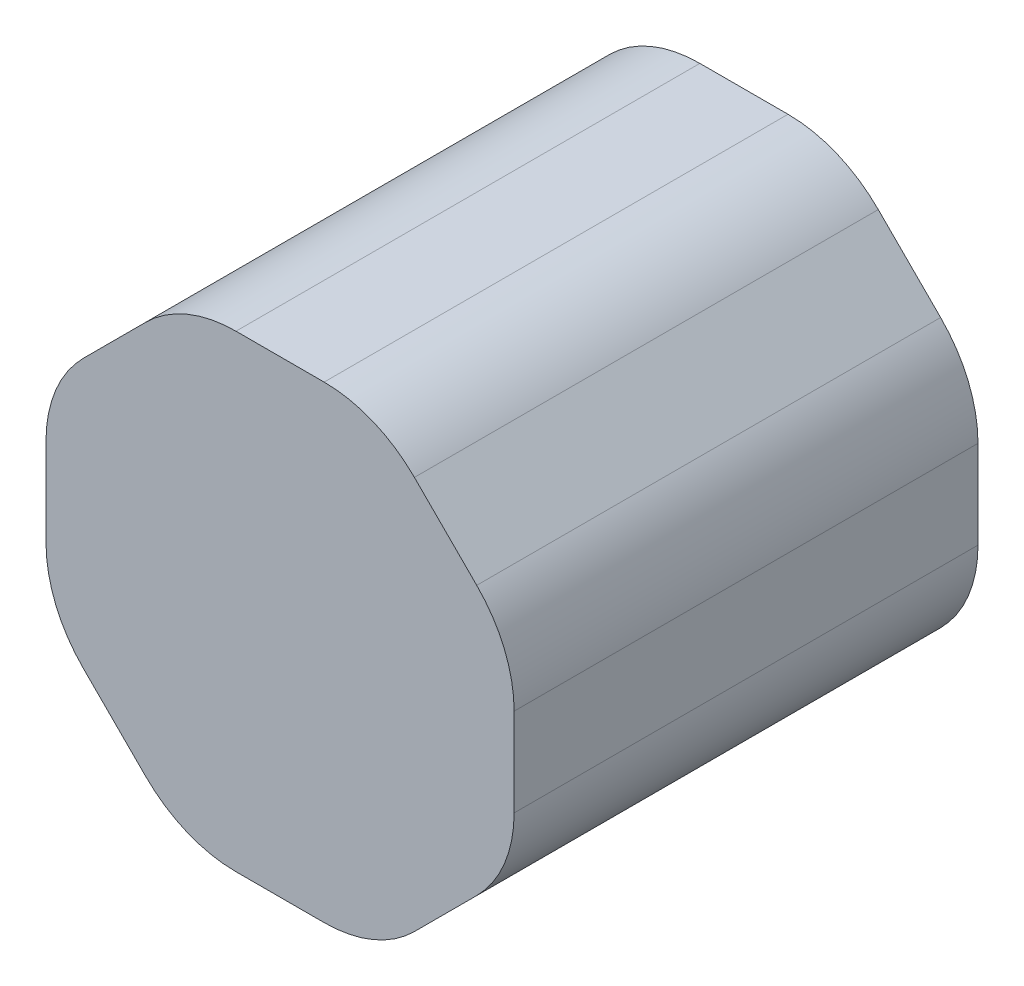
ISO-10303-21;
HEADER;
FILE_DESCRIPTION(('STEP AP214'),'2;1');
FILE_NAME('part.step','',(''),(''),'','','');
FILE_SCHEMA(('AUTOMOTIVE_DESIGN { 1 0 10303 214 1 1 1 1 }'));
ENDSEC;
DATA;
#1=APPLICATION_CONTEXT('core data for automotive mechanical design processes');
#2=APPLICATION_PROTOCOL_DEFINITION('international standard','automotive_design',2000,#1);
#3=PRODUCT_CONTEXT('',#1,'mechanical');
#4=PRODUCT('Part','Part','',(#3));
#5=PRODUCT_RELATED_PRODUCT_CATEGORY('part','',(#4));
#6=PRODUCT_DEFINITION_FORMATION('','',#4);
#7=PRODUCT_DEFINITION_CONTEXT('part definition',#1,'design');
#8=PRODUCT_DEFINITION('design','',#6,#7);
#9=PRODUCT_DEFINITION_SHAPE('','',#8);
#10=(LENGTH_UNIT() NAMED_UNIT(*) SI_UNIT(.MILLI.,.METRE.));
#11=(NAMED_UNIT(*) PLANE_ANGLE_UNIT() SI_UNIT($,.RADIAN.));
#12=(NAMED_UNIT(*) SI_UNIT($,.STERADIAN.) SOLID_ANGLE_UNIT());
#13=UNCERTAINTY_MEASURE_WITH_UNIT(LENGTH_MEASURE(1.E-05),#10,'distance_accuracy_value','');
#14=(GEOMETRIC_REPRESENTATION_CONTEXT(3) GLOBAL_UNCERTAINTY_ASSIGNED_CONTEXT((#13)) GLOBAL_UNIT_ASSIGNED_CONTEXT((#10,
#11,#12)) REPRESENTATION_CONTEXT('',''));
#15=CARTESIAN_POINT('',(0.,0.,0.));
#16=DIRECTION('',(0.,0.,1.));
#17=DIRECTION('',(1.,0.,0.));
#18=AXIS2_PLACEMENT_3D('',#15,#16,#17);
#19=CARTESIAN_POINT('',(-25.,-10.3553390593274,109.));
#20=DIRECTION('',(0.,0.,-1.));
#21=DIRECTION('',(-1.,0.,0.));
#22=AXIS2_PLACEMENT_3D('',#19,#20,#21);
#23=CYLINDRICAL_SURFACE('',#22,30.);
#24=CARTESIAN_POINT('',(-25.,-10.3553390593274,0.));
#25=DIRECTION('',(0.,0.,1.));
#26=DIRECTION('',(1.,0.,0.));
#27=AXIS2_PLACEMENT_3D('',#24,#25,#26);
#28=CIRCLE('',#27,30.);
#29=CARTESIAN_POINT('',(-55.,-10.3553390593273,0.));
#30=VERTEX_POINT('',#29);
#31=CARTESIAN_POINT('',(-46.2132034355963,-31.5685424949239,0.));
#32=VERTEX_POINT('',#31);
#33=EDGE_CURVE('E177',#30,#32,#28,.T.);
#34=ORIENTED_EDGE('',*,*,#33,.T.);
#35=DIRECTION('',(0.,0.,-1.));
#36=VECTOR('',#35,1.);
#37=CARTESIAN_POINT('',(-46.2132034355963,-31.5685424949239,109.));
#38=LINE('',#37,#36);
#39=CARTESIAN_POINT('',(-46.2132034355963,-31.5685424949239,109.));
#40=VERTEX_POINT('',#39);
#41=EDGE_CURVE('E11',#40,#32,#38,.T.);
#42=ORIENTED_EDGE('',*,*,#41,.F.);
#43=CARTESIAN_POINT('',(-25.,-10.3553390593274,109.));
#44=DIRECTION('',(0.,0.,1.));
#45=DIRECTION('',(1.,0.,0.));
#46=AXIS2_PLACEMENT_3D('',#43,#44,#45);
#47=CIRCLE('',#46,30.);
#48=CARTESIAN_POINT('',(-55.,-10.3553390593273,109.));
#49=VERTEX_POINT('',#48);
#50=EDGE_CURVE('E207',#49,#40,#47,.T.);
#51=ORIENTED_EDGE('',*,*,#50,.F.);
#52=DIRECTION('',(0.,0.,-1.));
#53=VECTOR('',#52,1.);
#54=CARTESIAN_POINT('',(-55.,-10.3553390593273,109.));
#55=LINE('',#54,#53);
#56=EDGE_CURVE('E173',#49,#30,#55,.T.);
#57=ORIENTED_EDGE('',*,*,#56,.T.);
#58=EDGE_LOOP('',(#34,#42,#51,#57));
#59=FACE_BOUND('',#58,.T.);
#60=ADVANCED_FACE('F33',(#59),#23,.T.);
#61=CARTESIAN_POINT('',(-46.2132034355963,-31.5685424949239,109.));
#62=DIRECTION('',(0.707106781186547,0.707106781186548,0.));
#63=DIRECTION('',(-0.707106781186548,0.707106781186547,0.));
#64=AXIS2_PLACEMENT_3D('',#61,#62,#63);
#65=PLANE('',#64);
#66=DIRECTION('',(0.707106781186548,-0.707106781186547,0.));
#67=VECTOR('',#66,1.);
#68=CARTESIAN_POINT('',(-46.2132034355963,-31.5685424949239,0.));
#69=LINE('',#68,#67);
#70=CARTESIAN_POINT('',(-31.5685424949239,-46.2132034355963,0.));
#71=VERTEX_POINT('',#70);
#72=EDGE_CURVE('E180',#32,#71,#69,.T.);
#73=ORIENTED_EDGE('',*,*,#72,.T.);
#74=DIRECTION('',(0.,0.,-1.));
#75=VECTOR('',#74,1.);
#76=CARTESIAN_POINT('',(-31.5685424949239,-46.2132034355963,109.));
#77=LINE('',#76,#75);
#78=CARTESIAN_POINT('',(-31.5685424949239,-46.2132034355963,109.));
#79=VERTEX_POINT('',#78);
#80=EDGE_CURVE('E41',#79,#71,#77,.T.);
#81=ORIENTED_EDGE('',*,*,#80,.F.);
#82=DIRECTION('',(0.707106781186548,-0.707106781186547,0.));
#83=VECTOR('',#82,1.);
#84=CARTESIAN_POINT('',(-46.2132034355963,-31.5685424949239,109.));
#85=LINE('',#84,#83);
#86=EDGE_CURVE('E116',#40,#79,#85,.T.);
#87=ORIENTED_EDGE('',*,*,#86,.F.);
#88=ORIENTED_EDGE('',*,*,#41,.T.);
#89=EDGE_LOOP('',(#73,#81,#87,#88));
#90=FACE_BOUND('',#89,.T.);
#91=ADVANCED_FACE('F305',(#90),#65,.F.);
#92=CARTESIAN_POINT('',(-10.3553390593274,-25.,109.));
#93=DIRECTION('',(0.,0.,-1.));
#94=DIRECTION('',(-1.,0.,0.));
#95=AXIS2_PLACEMENT_3D('',#92,#93,#94);
#96=CYLINDRICAL_SURFACE('',#95,30.);
#97=CARTESIAN_POINT('',(-10.3553390593274,-25.,0.));
#98=DIRECTION('',(0.,0.,1.));
#99=DIRECTION('',(1.,0.,0.));
#100=AXIS2_PLACEMENT_3D('',#97,#98,#99);
#101=CIRCLE('',#100,30.);
#102=CARTESIAN_POINT('',(-10.3553390593272,-55.,0.));
#103=VERTEX_POINT('',#102);
#104=EDGE_CURVE('E182',#71,#103,#101,.T.);
#105=ORIENTED_EDGE('',*,*,#104,.T.);
#106=DIRECTION('',(0.,0.,-1.));
#107=VECTOR('',#106,1.);
#108=CARTESIAN_POINT('',(-10.3553390593272,-55.,109.));
#109=LINE('',#108,#107);
#110=CARTESIAN_POINT('',(-10.3553390593272,-55.,109.));
#111=VERTEX_POINT('',#110);
#112=EDGE_CURVE('E238',#111,#103,#109,.T.);
#113=ORIENTED_EDGE('',*,*,#112,.F.);
#114=CARTESIAN_POINT('',(-10.3553390593274,-25.,109.));
#115=DIRECTION('',(0.,0.,1.));
#116=DIRECTION('',(1.,0.,0.));
#117=AXIS2_PLACEMENT_3D('',#114,#115,#116);
#118=CIRCLE('',#117,30.);
#119=EDGE_CURVE('E246',#79,#111,#118,.T.);
#120=ORIENTED_EDGE('',*,*,#119,.F.);
#121=ORIENTED_EDGE('',*,*,#80,.T.);
#122=EDGE_LOOP('',(#105,#113,#120,#121));
#123=FACE_BOUND('',#122,.T.);
#124=ADVANCED_FACE('F244',(#123),#96,.T.);
#125=CARTESIAN_POINT('',(-10.3553390593272,-55.,109.));
#126=DIRECTION('',(0.,1.,0.));
#127=DIRECTION('',(-1.,0.,0.));
#128=AXIS2_PLACEMENT_3D('',#125,#126,#127);
#129=PLANE('',#128);
#130=DIRECTION('',(1.,0.,0.));
#131=VECTOR('',#130,1.);
#132=CARTESIAN_POINT('',(-10.3553390593272,-55.,0.));
#133=LINE('',#132,#131);
#134=CARTESIAN_POINT('',(10.3553390593273,-55.,0.));
#135=VERTEX_POINT('',#134);
#136=EDGE_CURVE('E184',#103,#135,#133,.T.);
#137=ORIENTED_EDGE('',*,*,#136,.T.);
#138=DIRECTION('',(0.,0.,-1.));
#139=VECTOR('',#138,1.);
#140=CARTESIAN_POINT('',(10.3553390593273,-55.,109.));
#141=LINE('',#140,#139);
#142=CARTESIAN_POINT('',(10.3553390593273,-55.,109.));
#143=VERTEX_POINT('',#142);
#144=EDGE_CURVE('E235',#143,#135,#141,.T.);
#145=ORIENTED_EDGE('',*,*,#144,.F.);
#146=DIRECTION('',(1.,0.,0.));
#147=VECTOR('',#146,1.);
#148=CARTESIAN_POINT('',(-10.3553390593272,-55.,109.));
#149=LINE('',#148,#147);
#150=EDGE_CURVE('E264',#111,#143,#149,.T.);
#151=ORIENTED_EDGE('',*,*,#150,.F.);
#152=ORIENTED_EDGE('',*,*,#112,.T.);
#153=EDGE_LOOP('',(#137,#145,#151,#152));
#154=FACE_BOUND('',#153,.T.);
#155=ADVANCED_FACE('F255',(#154),#129,.F.);
#156=CARTESIAN_POINT('',(10.3553390593274,-25.,109.));
#157=DIRECTION('',(0.,0.,-1.));
#158=DIRECTION('',(-1.,0.,0.));
#159=AXIS2_PLACEMENT_3D('',#156,#157,#158);
#160=CYLINDRICAL_SURFACE('',#159,30.);
#161=CARTESIAN_POINT('',(10.3553390593274,-25.,0.));
#162=DIRECTION('',(0.,0.,1.));
#163=DIRECTION('',(1.,0.,0.));
#164=AXIS2_PLACEMENT_3D('',#161,#162,#163);
#165=CIRCLE('',#164,30.);
#166=CARTESIAN_POINT('',(31.5685424949239,-46.2132034355963,0.));
#167=VERTEX_POINT('',#166);
#168=EDGE_CURVE('E186',#135,#167,#165,.T.);
#169=ORIENTED_EDGE('',*,*,#168,.T.);
#170=DIRECTION('',(0.,0.,-1.));
#171=VECTOR('',#170,1.);
#172=CARTESIAN_POINT('',(31.5685424949239,-46.2132034355963,109.));
#173=LINE('',#172,#171);
#174=CARTESIAN_POINT('',(31.5685424949239,-46.2132034355963,109.));
#175=VERTEX_POINT('',#174);
#176=EDGE_CURVE('E232',#175,#167,#173,.T.);
#177=ORIENTED_EDGE('',*,*,#176,.F.);
#178=CARTESIAN_POINT('',(10.3553390593274,-25.,109.));
#179=DIRECTION('',(0.,0.,1.));
#180=DIRECTION('',(1.,0.,0.));
#181=AXIS2_PLACEMENT_3D('',#178,#179,#180);
#182=CIRCLE('',#181,30.);
#183=EDGE_CURVE('E261',#143,#175,#182,.T.);
#184=ORIENTED_EDGE('',*,*,#183,.F.);
#185=ORIENTED_EDGE('',*,*,#144,.T.);
#186=EDGE_LOOP('',(#169,#177,#184,#185));
#187=FACE_BOUND('',#186,.T.);
#188=ADVANCED_FACE('F259',(#187),#160,.T.);
#189=CARTESIAN_POINT('',(31.5685424949239,-46.2132034355963,109.));
#190=DIRECTION('',(-0.707106781186548,0.707106781186548,0.));
#191=DIRECTION('',(-0.707106781186548,-0.707106781186548,0.));
#192=AXIS2_PLACEMENT_3D('',#189,#190,#191);
#193=PLANE('',#192);
#194=DIRECTION('',(0.707106781186548,0.707106781186548,0.));
#195=VECTOR('',#194,1.);
#196=CARTESIAN_POINT('',(31.5685424949239,-46.2132034355963,0.));
#197=LINE('',#196,#195);
#198=CARTESIAN_POINT('',(46.2132034355964,-31.5685424949239,0.));
#199=VERTEX_POINT('',#198);
#200=EDGE_CURVE('E188',#167,#199,#197,.T.);
#201=ORIENTED_EDGE('',*,*,#200,.T.);
#202=DIRECTION('',(0.,0.,-1.));
#203=VECTOR('',#202,1.);
#204=CARTESIAN_POINT('',(46.2132034355964,-31.5685424949239,109.));
#205=LINE('',#204,#203);
#206=CARTESIAN_POINT('',(46.2132034355964,-31.5685424949239,109.));
#207=VERTEX_POINT('',#206);
#208=EDGE_CURVE('E229',#207,#199,#205,.T.);
#209=ORIENTED_EDGE('',*,*,#208,.F.);
#210=DIRECTION('',(0.707106781186548,0.707106781186548,0.));
#211=VECTOR('',#210,1.);
#212=CARTESIAN_POINT('',(31.5685424949239,-46.2132034355963,109.));
#213=LINE('',#212,#211);
#214=EDGE_CURVE('E263',#175,#207,#213,.T.);
#215=ORIENTED_EDGE('',*,*,#214,.F.);
#216=ORIENTED_EDGE('',*,*,#176,.T.);
#217=EDGE_LOOP('',(#201,#209,#215,#216));
#218=FACE_BOUND('',#217,.T.);
#219=ADVANCED_FACE('F318',(#218),#193,.F.);
#220=CARTESIAN_POINT('',(25.,-10.3553390593273,109.));
#221=DIRECTION('',(0.,0.,-1.));
#222=DIRECTION('',(-1.,0.,0.));
#223=AXIS2_PLACEMENT_3D('',#220,#221,#222);
#224=CYLINDRICAL_SURFACE('',#223,30.);
#225=CARTESIAN_POINT('',(25.,-10.3553390593273,0.));
#226=DIRECTION('',(0.,0.,1.));
#227=DIRECTION('',(-1.,0.,0.));
#228=AXIS2_PLACEMENT_3D('',#225,#226,#227);
#229=CIRCLE('',#228,30.);
#230=CARTESIAN_POINT('',(55.,-10.3553390593272,0.));
#231=VERTEX_POINT('',#230);
#232=EDGE_CURVE('E190',#199,#231,#229,.T.);
#233=ORIENTED_EDGE('',*,*,#232,.T.);
#234=DIRECTION('',(0.,0.,-1.));
#235=VECTOR('',#234,1.);
#236=CARTESIAN_POINT('',(55.,-10.3553390593272,109.));
#237=LINE('',#236,#235);
#238=CARTESIAN_POINT('',(55.,-10.3553390593272,109.));
#239=VERTEX_POINT('',#238);
#240=EDGE_CURVE('E226',#239,#231,#237,.T.);
#241=ORIENTED_EDGE('',*,*,#240,.F.);
#242=CARTESIAN_POINT('',(25.,-10.3553390593273,109.));
#243=DIRECTION('',(0.,0.,1.));
#244=DIRECTION('',(-1.,0.,0.));
#245=AXIS2_PLACEMENT_3D('',#242,#243,#244);
#246=CIRCLE('',#245,30.);
#247=EDGE_CURVE('E266',#207,#239,#246,.T.);
#248=ORIENTED_EDGE('',*,*,#247,.F.);
#249=ORIENTED_EDGE('',*,*,#208,.T.);
#250=EDGE_LOOP('',(#233,#241,#248,#249));
#251=FACE_BOUND('',#250,.T.);
#252=ADVANCED_FACE('F321',(#251),#224,.T.);
#253=CARTESIAN_POINT('',(55.,-10.3553390593272,109.));
#254=DIRECTION('',(-1.,0.,0.));
#255=DIRECTION('',(0.,-1.,0.));
#256=AXIS2_PLACEMENT_3D('',#253,#254,#255);
#257=PLANE('',#256);
#258=DIRECTION('',(0.,1.,0.));
#259=VECTOR('',#258,1.);
#260=CARTESIAN_POINT('',(55.,-10.3553390593272,0.));
#261=LINE('',#260,#259);
#262=CARTESIAN_POINT('',(55.,10.3553390593272,0.));
#263=VERTEX_POINT('',#262);
#264=EDGE_CURVE('E192',#231,#263,#261,.T.);
#265=ORIENTED_EDGE('',*,*,#264,.T.);
#266=DIRECTION('',(0.,0.,-1.));
#267=VECTOR('',#266,1.);
#268=CARTESIAN_POINT('',(55.,10.3553390593272,109.));
#269=LINE('',#268,#267);
#270=CARTESIAN_POINT('',(55.,10.3553390593272,109.));
#271=VERTEX_POINT('',#270);
#272=EDGE_CURVE('E223',#271,#263,#269,.T.);
#273=ORIENTED_EDGE('',*,*,#272,.F.);
#274=DIRECTION('',(0.,1.,0.));
#275=VECTOR('',#274,1.);
#276=CARTESIAN_POINT('',(55.,-10.3553390593272,109.));
#277=LINE('',#276,#275);
#278=EDGE_CURVE('E272',#239,#271,#277,.T.);
#279=ORIENTED_EDGE('',*,*,#278,.F.);
#280=ORIENTED_EDGE('',*,*,#240,.T.);
#281=EDGE_LOOP('',(#265,#273,#279,#280));
#282=FACE_BOUND('',#281,.T.);
#283=ADVANCED_FACE('F325',(#282),#257,.F.);
#284=CARTESIAN_POINT('',(25.,10.3553390593273,109.));
#285=DIRECTION('',(0.,0.,-1.));
#286=DIRECTION('',(-1.,0.,0.));
#287=AXIS2_PLACEMENT_3D('',#284,#285,#286);
#288=CYLINDRICAL_SURFACE('',#287,30.);
#289=CARTESIAN_POINT('',(25.,10.3553390593273,0.));
#290=DIRECTION('',(0.,0.,1.));
#291=DIRECTION('',(1.,0.,0.));
#292=AXIS2_PLACEMENT_3D('',#289,#290,#291);
#293=CIRCLE('',#292,30.);
#294=CARTESIAN_POINT('',(46.2132034355963,31.5685424949239,0.));
#295=VERTEX_POINT('',#294);
#296=EDGE_CURVE('E194',#263,#295,#293,.T.);
#297=ORIENTED_EDGE('',*,*,#296,.T.);
#298=DIRECTION('',(0.,0.,-1.));
#299=VECTOR('',#298,1.);
#300=CARTESIAN_POINT('',(46.2132034355963,31.5685424949239,109.));
#301=LINE('',#300,#299);
#302=CARTESIAN_POINT('',(46.2132034355963,31.5685424949239,109.));
#303=VERTEX_POINT('',#302);
#304=EDGE_CURVE('E220',#303,#295,#301,.T.);
#305=ORIENTED_EDGE('',*,*,#304,.F.);
#306=CARTESIAN_POINT('',(25.,10.3553390593273,109.));
#307=DIRECTION('',(0.,0.,1.));
#308=DIRECTION('',(1.,0.,0.));
#309=AXIS2_PLACEMENT_3D('',#306,#307,#308);
#310=CIRCLE('',#309,30.);
#311=EDGE_CURVE('E274',#271,#303,#310,.T.);
#312=ORIENTED_EDGE('',*,*,#311,.F.);
#313=ORIENTED_EDGE('',*,*,#272,.T.);
#314=EDGE_LOOP('',(#297,#305,#312,#313));
#315=FACE_BOUND('',#314,.T.);
#316=ADVANCED_FACE('F329',(#315),#288,.T.);
#317=CARTESIAN_POINT('',(46.2132034355963,31.5685424949239,109.));
#318=DIRECTION('',(-0.707106781186547,-0.707106781186548,0.));
#319=DIRECTION('',(0.707106781186548,-0.707106781186547,0.));
#320=AXIS2_PLACEMENT_3D('',#317,#318,#319);
#321=PLANE('',#320);
#322=DIRECTION('',(-0.707106781186548,0.707106781186547,0.));
#323=VECTOR('',#322,1.);
#324=CARTESIAN_POINT('',(46.2132034355963,31.5685424949239,0.));
#325=LINE('',#324,#323);
#326=CARTESIAN_POINT('',(31.5685424949239,46.2132034355963,0.));
#327=VERTEX_POINT('',#326);
#328=EDGE_CURVE('E196',#295,#327,#325,.T.);
#329=ORIENTED_EDGE('',*,*,#328,.T.);
#330=DIRECTION('',(0.,0.,-1.));
#331=VECTOR('',#330,1.);
#332=CARTESIAN_POINT('',(31.5685424949239,46.2132034355963,109.));
#333=LINE('',#332,#331);
#334=CARTESIAN_POINT('',(31.5685424949239,46.2132034355963,109.));
#335=VERTEX_POINT('',#334);
#336=EDGE_CURVE('E217',#335,#327,#333,.T.);
#337=ORIENTED_EDGE('',*,*,#336,.F.);
#338=DIRECTION('',(-0.707106781186548,0.707106781186547,0.));
#339=VECTOR('',#338,1.);
#340=CARTESIAN_POINT('',(46.2132034355963,31.5685424949239,109.));
#341=LINE('',#340,#339);
#342=EDGE_CURVE('E276',#303,#335,#341,.T.);
#343=ORIENTED_EDGE('',*,*,#342,.F.);
#344=ORIENTED_EDGE('',*,*,#304,.T.);
#345=EDGE_LOOP('',(#329,#337,#343,#344));
#346=FACE_BOUND('',#345,.T.);
#347=ADVANCED_FACE('F333',(#346),#321,.F.);
#348=CARTESIAN_POINT('',(10.3553390593274,25.,109.));
#349=DIRECTION('',(0.,0.,-1.));
#350=DIRECTION('',(-1.,0.,0.));
#351=AXIS2_PLACEMENT_3D('',#348,#349,#350);
#352=CYLINDRICAL_SURFACE('',#351,30.);
#353=CARTESIAN_POINT('',(10.3553390593274,25.,0.));
#354=DIRECTION('',(0.,0.,1.));
#355=DIRECTION('',(1.,0.,0.));
#356=AXIS2_PLACEMENT_3D('',#353,#354,#355);
#357=CIRCLE('',#356,30.);
#358=CARTESIAN_POINT('',(10.3553390593272,55.,0.));
#359=VERTEX_POINT('',#358);
#360=EDGE_CURVE('E198',#327,#359,#357,.T.);
#361=ORIENTED_EDGE('',*,*,#360,.T.);
#362=DIRECTION('',(0.,0.,-1.));
#363=VECTOR('',#362,1.);
#364=CARTESIAN_POINT('',(10.3553390593272,55.,109.));
#365=LINE('',#364,#363);
#366=CARTESIAN_POINT('',(10.3553390593272,55.,109.));
#367=VERTEX_POINT('',#366);
#368=EDGE_CURVE('E214',#367,#359,#365,.T.);
#369=ORIENTED_EDGE('',*,*,#368,.F.);
#370=CARTESIAN_POINT('',(10.3553390593274,25.,109.));
#371=DIRECTION('',(0.,0.,1.));
#372=DIRECTION('',(1.,0.,0.));
#373=AXIS2_PLACEMENT_3D('',#370,#371,#372);
#374=CIRCLE('',#373,30.);
#375=EDGE_CURVE('E278',#335,#367,#374,.T.);
#376=ORIENTED_EDGE('',*,*,#375,.F.);
#377=ORIENTED_EDGE('',*,*,#336,.T.);
#378=EDGE_LOOP('',(#361,#369,#376,#377));
#379=FACE_BOUND('',#378,.T.);
#380=ADVANCED_FACE('F337',(#379),#352,.T.);
#381=CARTESIAN_POINT('',(10.3553390593272,55.,109.));
#382=DIRECTION('',(0.,-1.,0.));
#383=DIRECTION('',(1.,0.,0.));
#384=AXIS2_PLACEMENT_3D('',#381,#382,#383);
#385=PLANE('',#384);
#386=DIRECTION('',(-1.,0.,0.));
#387=VECTOR('',#386,1.);
#388=CARTESIAN_POINT('',(10.3553390593272,55.,0.));
#389=LINE('',#388,#387);
#390=CARTESIAN_POINT('',(-10.3553390593272,55.,0.));
#391=VERTEX_POINT('',#390);
#392=EDGE_CURVE('E200',#359,#391,#389,.T.);
#393=ORIENTED_EDGE('',*,*,#392,.T.);
#394=DIRECTION('',(0.,0.,-1.));
#395=VECTOR('',#394,1.);
#396=CARTESIAN_POINT('',(-10.3553390593272,55.,109.));
#397=LINE('',#396,#395);
#398=CARTESIAN_POINT('',(-10.3553390593272,55.,109.));
#399=VERTEX_POINT('',#398);
#400=EDGE_CURVE('E211',#399,#391,#397,.T.);
#401=ORIENTED_EDGE('',*,*,#400,.F.);
#402=DIRECTION('',(-1.,0.,0.));
#403=VECTOR('',#402,1.);
#404=CARTESIAN_POINT('',(10.3553390593272,55.,109.));
#405=LINE('',#404,#403);
#406=EDGE_CURVE('E280',#367,#399,#405,.T.);
#407=ORIENTED_EDGE('',*,*,#406,.F.);
#408=ORIENTED_EDGE('',*,*,#368,.T.);
#409=EDGE_LOOP('',(#393,#401,#407,#408));
#410=FACE_BOUND('',#409,.T.);
#411=ADVANCED_FACE('F286',(#410),#385,.F.);
#412=CARTESIAN_POINT('',(-10.3553390593274,25.,109.));
#413=DIRECTION('',(0.,0.,-1.));
#414=DIRECTION('',(-1.,0.,0.));
#415=AXIS2_PLACEMENT_3D('',#412,#413,#414);
#416=CYLINDRICAL_SURFACE('',#415,30.);
#417=CARTESIAN_POINT('',(-10.3553390593274,25.,0.));
#418=DIRECTION('',(0.,0.,1.));
#419=DIRECTION('',(1.,0.,0.));
#420=AXIS2_PLACEMENT_3D('',#417,#418,#419);
#421=CIRCLE('',#420,30.);
#422=CARTESIAN_POINT('',(-31.5685424949239,46.2132034355963,0.));
#423=VERTEX_POINT('',#422);
#424=EDGE_CURVE('E202',#391,#423,#421,.T.);
#425=ORIENTED_EDGE('',*,*,#424,.T.);
#426=DIRECTION('',(0.,0.,-1.));
#427=VECTOR('',#426,1.);
#428=CARTESIAN_POINT('',(-31.5685424949239,46.2132034355963,109.));
#429=LINE('',#428,#427);
#430=CARTESIAN_POINT('',(-31.5685424949239,46.2132034355963,109.));
#431=VERTEX_POINT('',#430);
#432=EDGE_CURVE('E168',#431,#423,#429,.T.);
#433=ORIENTED_EDGE('',*,*,#432,.F.);
#434=CARTESIAN_POINT('',(-10.3553390593274,25.,109.));
#435=DIRECTION('',(0.,0.,1.));
#436=DIRECTION('',(1.,0.,0.));
#437=AXIS2_PLACEMENT_3D('',#434,#435,#436);
#438=CIRCLE('',#437,30.);
#439=EDGE_CURVE('E159',#399,#431,#438,.T.);
#440=ORIENTED_EDGE('',*,*,#439,.F.);
#441=ORIENTED_EDGE('',*,*,#400,.T.);
#442=EDGE_LOOP('',(#425,#433,#440,#441));
#443=FACE_BOUND('',#442,.T.);
#444=ADVANCED_FACE('F290',(#443),#416,.T.);
#445=CARTESIAN_POINT('',(-31.5685424949239,46.2132034355963,109.));
#446=DIRECTION('',(0.707106781186548,-0.707106781186547,0.));
#447=DIRECTION('',(0.707106781186547,0.707106781186548,0.));
#448=AXIS2_PLACEMENT_3D('',#445,#446,#447);
#449=PLANE('',#448);
#450=DIRECTION('',(-0.707106781186547,-0.707106781186548,0.));
#451=VECTOR('',#450,1.);
#452=CARTESIAN_POINT('',(-31.5685424949239,46.2132034355963,0.));
#453=LINE('',#452,#451);
#454=CARTESIAN_POINT('',(-46.2132034355963,31.5685424949238,0.));
#455=VERTEX_POINT('',#454);
#456=EDGE_CURVE('E167',#423,#455,#453,.T.);
#457=ORIENTED_EDGE('',*,*,#456,.T.);
#458=DIRECTION('',(0.,0.,-1.));
#459=VECTOR('',#458,1.);
#460=CARTESIAN_POINT('',(-46.2132034355963,31.5685424949238,109.));
#461=LINE('',#460,#459);
#462=CARTESIAN_POINT('',(-46.2132034355963,31.5685424949238,109.));
#463=VERTEX_POINT('',#462);
#464=EDGE_CURVE('E164',#463,#455,#461,.T.);
#465=ORIENTED_EDGE('',*,*,#464,.F.);
#466=DIRECTION('',(-0.707106781186547,-0.707106781186548,0.));
#467=VECTOR('',#466,1.);
#468=CARTESIAN_POINT('',(-31.5685424949239,46.2132034355963,109.));
#469=LINE('',#468,#467);
#470=EDGE_CURVE('E153',#431,#463,#469,.T.);
#471=ORIENTED_EDGE('',*,*,#470,.F.);
#472=ORIENTED_EDGE('',*,*,#432,.T.);
#473=EDGE_LOOP('',(#457,#465,#471,#472));
#474=FACE_BOUND('',#473,.T.);
#475=ADVANCED_FACE('F165',(#474),#449,.F.);
#476=CARTESIAN_POINT('',(-25.,10.3553390593273,109.));
#477=DIRECTION('',(0.,0.,-1.));
#478=DIRECTION('',(-1.,0.,0.));
#479=AXIS2_PLACEMENT_3D('',#476,#477,#478);
#480=CYLINDRICAL_SURFACE('',#479,30.);
#481=CARTESIAN_POINT('',(-25.,10.3553390593273,0.));
#482=DIRECTION('',(0.,0.,1.));
#483=DIRECTION('',(1.,0.,0.));
#484=AXIS2_PLACEMENT_3D('',#481,#482,#483);
#485=CIRCLE('',#484,30.);
#486=CARTESIAN_POINT('',(-55.,10.3553390593272,0.));
#487=VERTEX_POINT('',#486);
#488=EDGE_CURVE('E102',#455,#487,#485,.T.);
#489=ORIENTED_EDGE('',*,*,#488,.T.);
#490=DIRECTION('',(0.,0.,-1.));
#491=VECTOR('',#490,1.);
#492=CARTESIAN_POINT('',(-55.,10.3553390593272,109.));
#493=LINE('',#492,#491);
#494=CARTESIAN_POINT('',(-55.,10.3553390593272,109.));
#495=VERTEX_POINT('',#494);
#496=EDGE_CURVE('E169',#495,#487,#493,.T.);
#497=ORIENTED_EDGE('',*,*,#496,.F.);
#498=CARTESIAN_POINT('',(-25.,10.3553390593273,109.));
#499=DIRECTION('',(0.,0.,1.));
#500=DIRECTION('',(1.,0.,0.));
#501=AXIS2_PLACEMENT_3D('',#498,#499,#500);
#502=CIRCLE('',#501,30.);
#503=EDGE_CURVE('E157',#463,#495,#502,.T.);
#504=ORIENTED_EDGE('',*,*,#503,.F.);
#505=ORIENTED_EDGE('',*,*,#464,.T.);
#506=EDGE_LOOP('',(#489,#497,#504,#505));
#507=FACE_BOUND('',#506,.T.);
#508=ADVANCED_FACE('F171',(#507),#480,.T.);
#509=CARTESIAN_POINT('',(-55.,10.3553390593272,109.));
#510=DIRECTION('',(1.,0.,0.));
#511=DIRECTION('',(0.,1.,0.));
#512=AXIS2_PLACEMENT_3D('',#509,#510,#511);
#513=PLANE('',#512);
#514=DIRECTION('',(0.,-1.,0.));
#515=VECTOR('',#514,1.);
#516=CARTESIAN_POINT('',(-55.,10.3553390593272,0.));
#517=LINE('',#516,#515);
#518=EDGE_CURVE('E108',#487,#30,#517,.T.);
#519=ORIENTED_EDGE('',*,*,#518,.T.);
#520=ORIENTED_EDGE('',*,*,#56,.F.);
#521=DIRECTION('',(0.,-1.,0.));
#522=VECTOR('',#521,1.);
#523=CARTESIAN_POINT('',(-55.,10.3553390593272,109.));
#524=LINE('',#523,#522);
#525=EDGE_CURVE('E49',#495,#49,#524,.T.);
#526=ORIENTED_EDGE('',*,*,#525,.F.);
#527=ORIENTED_EDGE('',*,*,#496,.T.);
#528=EDGE_LOOP('',(#519,#520,#526,#527));
#529=FACE_BOUND('',#528,.T.);
#530=ADVANCED_FACE('F294',(#529),#513,.F.);
#531=CARTESIAN_POINT('',(-25.,-10.3553390593274,109.));
#532=DIRECTION('',(0.,0.,1.));
#533=DIRECTION('',(1.,0.,0.));
#534=AXIS2_PLACEMENT_3D('',#531,#532,#533);
#535=PLANE('',#534);
#536=ORIENTED_EDGE('',*,*,#50,.T.);
#537=ORIENTED_EDGE('',*,*,#86,.T.);
#538=ORIENTED_EDGE('',*,*,#119,.T.);
#539=ORIENTED_EDGE('',*,*,#150,.T.);
#540=ORIENTED_EDGE('',*,*,#183,.T.);
#541=ORIENTED_EDGE('',*,*,#214,.T.);
#542=ORIENTED_EDGE('',*,*,#247,.T.);
#543=ORIENTED_EDGE('',*,*,#278,.T.);
#544=ORIENTED_EDGE('',*,*,#311,.T.);
#545=ORIENTED_EDGE('',*,*,#342,.T.);
#546=ORIENTED_EDGE('',*,*,#375,.T.);
#547=ORIENTED_EDGE('',*,*,#406,.T.);
#548=ORIENTED_EDGE('',*,*,#439,.T.);
#549=ORIENTED_EDGE('',*,*,#470,.T.);
#550=ORIENTED_EDGE('',*,*,#503,.T.);
#551=ORIENTED_EDGE('',*,*,#525,.T.);
#552=EDGE_LOOP('',(#536,#537,#538,#539,#540,#541,#542,#543,#544,#545,#546,#547,#548,#549,#550,#551));
#553=FACE_BOUND('',#552,.T.);
#554=ADVANCED_FACE('F155',(#553),#535,.T.);
#555=CARTESIAN_POINT('',(-25.,-10.3553390593274,0.));
#556=DIRECTION('',(0.,0.,1.));
#557=DIRECTION('',(1.,0.,0.));
#558=AXIS2_PLACEMENT_3D('',#555,#556,#557);
#559=PLANE('',#558);
#560=ORIENTED_EDGE('',*,*,#33,.F.);
#561=ORIENTED_EDGE('',*,*,#518,.F.);
#562=ORIENTED_EDGE('',*,*,#488,.F.);
#563=ORIENTED_EDGE('',*,*,#456,.F.);
#564=ORIENTED_EDGE('',*,*,#424,.F.);
#565=ORIENTED_EDGE('',*,*,#392,.F.);
#566=ORIENTED_EDGE('',*,*,#360,.F.);
#567=ORIENTED_EDGE('',*,*,#328,.F.);
#568=ORIENTED_EDGE('',*,*,#296,.F.);
#569=ORIENTED_EDGE('',*,*,#264,.F.);
#570=ORIENTED_EDGE('',*,*,#232,.F.);
#571=ORIENTED_EDGE('',*,*,#200,.F.);
#572=ORIENTED_EDGE('',*,*,#168,.F.);
#573=ORIENTED_EDGE('',*,*,#136,.F.);
#574=ORIENTED_EDGE('',*,*,#104,.F.);
#575=ORIENTED_EDGE('',*,*,#72,.F.);
#576=EDGE_LOOP('',(#560,#561,#562,#563,#564,#565,#566,#567,#568,#569,#570,#571,#572,#573,#574,#575));
#577=FACE_BOUND('',#576,.T.);
#578=ADVANCED_FACE('F250',(#577),#559,.F.);
#579=CLOSED_SHELL('',(#60,#91,#124,#155,#188,#219,#252,#283,#316,#347,#380,#411,#444,#475,#508,
#530,#554,#578));
#580=MANIFOLD_SOLID_BREP('B2',#579);
#581=ADVANCED_BREP_SHAPE_REPRESENTATION('',(#18,#580),#14);
#582=SHAPE_DEFINITION_REPRESENTATION(#9,#581);
ENDSEC;
END-ISO-10303-21;
